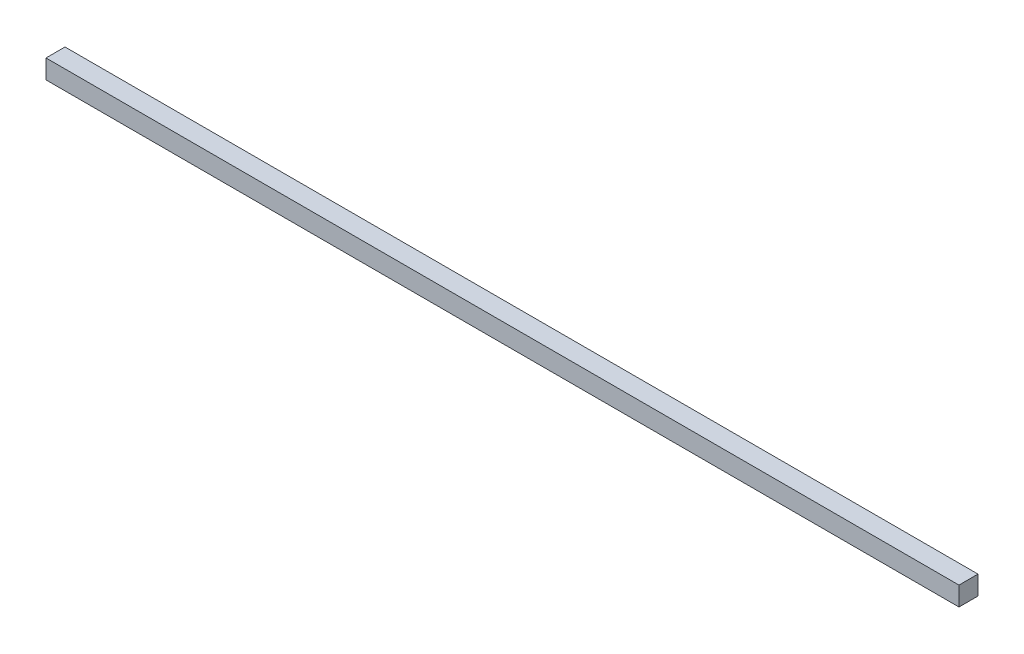
ISO-10303-21;
HEADER;
FILE_DESCRIPTION(('STEP AP214'),'2;1');
FILE_NAME('part.step','',(''),(''),'','','');
FILE_SCHEMA(('AUTOMOTIVE_DESIGN { 1 0 10303 214 1 1 1 1 }'));
ENDSEC;
DATA;
#1=APPLICATION_CONTEXT('core data for automotive mechanical design processes');
#2=APPLICATION_PROTOCOL_DEFINITION('international standard','automotive_design',2000,#1);
#3=PRODUCT_CONTEXT('',#1,'mechanical');
#4=PRODUCT('Part','Part','',(#3));
#5=PRODUCT_RELATED_PRODUCT_CATEGORY('part','',(#4));
#6=PRODUCT_DEFINITION_FORMATION('','',#4);
#7=PRODUCT_DEFINITION_CONTEXT('part definition',#1,'design');
#8=PRODUCT_DEFINITION('design','',#6,#7);
#9=PRODUCT_DEFINITION_SHAPE('','',#8);
#10=(LENGTH_UNIT() NAMED_UNIT(*) SI_UNIT(.MILLI.,.METRE.));
#11=(NAMED_UNIT(*) PLANE_ANGLE_UNIT() SI_UNIT($,.RADIAN.));
#12=(NAMED_UNIT(*) SI_UNIT($,.STERADIAN.) SOLID_ANGLE_UNIT());
#13=UNCERTAINTY_MEASURE_WITH_UNIT(LENGTH_MEASURE(1.E-05),#10,'distance_accuracy_value','');
#14=(GEOMETRIC_REPRESENTATION_CONTEXT(3) GLOBAL_UNCERTAINTY_ASSIGNED_CONTEXT((#13)) GLOBAL_UNIT_ASSIGNED_CONTEXT((#10,
#11,#12)) REPRESENTATION_CONTEXT('',''));
#15=CARTESIAN_POINT('',(0.,0.,0.));
#16=DIRECTION('',(0.,0.,1.));
#17=DIRECTION('',(1.,0.,0.));
#18=AXIS2_PLACEMENT_3D('',#15,#16,#17);
#19=CARTESIAN_POINT('',(0.,3.175,0.));
#20=DIRECTION('',(1.,0.,0.));
#21=DIRECTION('',(0.,0.,-1.));
#22=AXIS2_PLACEMENT_3D('',#19,#20,#21);
#23=PLANE('',#22);
#24=DIRECTION('',(0.,0.,1.));
#25=VECTOR('',#24,1.);
#26=CARTESIAN_POINT('',(0.,0.,0.));
#27=LINE('',#26,#25);
#28=CARTESIAN_POINT('',(0.,0.,-3.175));
#29=VERTEX_POINT('',#28);
#30=CARTESIAN_POINT('',(0.,0.,0.));
#31=VERTEX_POINT('',#30);
#32=EDGE_CURVE('E105',#29,#31,#27,.T.);
#33=ORIENTED_EDGE('',*,*,#32,.T.);
#34=DIRECTION('',(0.,-1.,0.));
#35=VECTOR('',#34,1.);
#36=CARTESIAN_POINT('',(0.,3.175,0.));
#37=LINE('',#36,#35);
#38=CARTESIAN_POINT('',(0.,3.175,0.));
#39=VERTEX_POINT('',#38);
#40=EDGE_CURVE('E11',#39,#31,#37,.T.);
#41=ORIENTED_EDGE('',*,*,#40,.F.);
#42=DIRECTION('',(0.,0.,1.));
#43=VECTOR('',#42,1.);
#44=CARTESIAN_POINT('',(0.,3.175,0.));
#45=LINE('',#44,#43);
#46=CARTESIAN_POINT('',(0.,3.175,-3.175));
#47=VERTEX_POINT('',#46);
#48=EDGE_CURVE('E89',#47,#39,#45,.T.);
#49=ORIENTED_EDGE('',*,*,#48,.F.);
#50=DIRECTION('',(0.,-1.,0.));
#51=VECTOR('',#50,1.);
#52=CARTESIAN_POINT('',(0.,3.175,-3.175));
#53=LINE('',#52,#51);
#54=EDGE_CURVE('E97',#47,#29,#53,.T.);
#55=ORIENTED_EDGE('',*,*,#54,.T.);
#56=EDGE_LOOP('',(#33,#41,#49,#55));
#57=FACE_BOUND('',#56,.T.);
#58=ADVANCED_FACE('F39',(#57),#23,.F.);
#59=CARTESIAN_POINT('',(0.,3.175,0.));
#60=DIRECTION('',(0.,0.,-1.));
#61=DIRECTION('',(-1.,0.,0.));
#62=AXIS2_PLACEMENT_3D('',#59,#60,#61);
#63=PLANE('',#62);
#64=DIRECTION('',(1.,0.,0.));
#65=VECTOR('',#64,1.);
#66=CARTESIAN_POINT('',(0.,0.,0.));
#67=LINE('',#66,#65);
#68=CARTESIAN_POINT('',(152.4,0.,0.));
#69=VERTEX_POINT('',#68);
#70=EDGE_CURVE('E92',#31,#69,#67,.T.);
#71=ORIENTED_EDGE('',*,*,#70,.T.);
#72=DIRECTION('',(0.,-1.,0.));
#73=VECTOR('',#72,1.);
#74=CARTESIAN_POINT('',(152.4,3.175,0.));
#75=LINE('',#74,#73);
#76=CARTESIAN_POINT('',(152.4,3.175,0.));
#77=VERTEX_POINT('',#76);
#78=EDGE_CURVE('E50',#77,#69,#75,.T.);
#79=ORIENTED_EDGE('',*,*,#78,.F.);
#80=DIRECTION('',(1.,0.,0.));
#81=VECTOR('',#80,1.);
#82=CARTESIAN_POINT('',(0.,3.175,0.));
#83=LINE('',#82,#81);
#84=EDGE_CURVE('E82',#39,#77,#83,.T.);
#85=ORIENTED_EDGE('',*,*,#84,.F.);
#86=ORIENTED_EDGE('',*,*,#40,.T.);
#87=EDGE_LOOP('',(#71,#79,#85,#86));
#88=FACE_BOUND('',#87,.T.);
#89=ADVANCED_FACE('F93',(#88),#63,.F.);
#90=CARTESIAN_POINT('',(152.4,3.175,0.));
#91=DIRECTION('',(-1.,0.,0.));
#92=DIRECTION('',(0.,0.,1.));
#93=AXIS2_PLACEMENT_3D('',#90,#91,#92);
#94=PLANE('',#93);
#95=DIRECTION('',(0.,0.,-1.));
#96=VECTOR('',#95,1.);
#97=CARTESIAN_POINT('',(152.4,0.,0.));
#98=LINE('',#97,#96);
#99=CARTESIAN_POINT('',(152.4,0.,-3.175));
#100=VERTEX_POINT('',#99);
#101=EDGE_CURVE('E72',#69,#100,#98,.T.);
#102=ORIENTED_EDGE('',*,*,#101,.T.);
#103=DIRECTION('',(0.,-1.,0.));
#104=VECTOR('',#103,1.);
#105=CARTESIAN_POINT('',(152.4,3.175,-3.175));
#106=LINE('',#105,#104);
#107=CARTESIAN_POINT('',(152.4,3.175,-3.175));
#108=VERTEX_POINT('',#107);
#109=EDGE_CURVE('E94',#108,#100,#106,.T.);
#110=ORIENTED_EDGE('',*,*,#109,.F.);
#111=DIRECTION('',(0.,0.,-1.));
#112=VECTOR('',#111,1.);
#113=CARTESIAN_POINT('',(152.4,3.175,0.));
#114=LINE('',#113,#112);
#115=EDGE_CURVE('E88',#77,#108,#114,.T.);
#116=ORIENTED_EDGE('',*,*,#115,.F.);
#117=ORIENTED_EDGE('',*,*,#78,.T.);
#118=EDGE_LOOP('',(#102,#110,#116,#117));
#119=FACE_BOUND('',#118,.T.);
#120=ADVANCED_FACE('F96',(#119),#94,.F.);
#121=CARTESIAN_POINT('',(0.,3.175,-3.175));
#122=DIRECTION('',(0.,0.,1.));
#123=DIRECTION('',(1.,0.,0.));
#124=AXIS2_PLACEMENT_3D('',#121,#122,#123);
#125=PLANE('',#124);
#126=DIRECTION('',(-1.,0.,0.));
#127=VECTOR('',#126,1.);
#128=CARTESIAN_POINT('',(0.,0.,-3.175));
#129=LINE('',#128,#127);
#130=EDGE_CURVE('E76',#100,#29,#129,.T.);
#131=ORIENTED_EDGE('',*,*,#130,.T.);
#132=ORIENTED_EDGE('',*,*,#54,.F.);
#133=DIRECTION('',(-1.,0.,0.));
#134=VECTOR('',#133,1.);
#135=CARTESIAN_POINT('',(0.,3.175,-3.175));
#136=LINE('',#135,#134);
#137=EDGE_CURVE('E54',#108,#47,#136,.T.);
#138=ORIENTED_EDGE('',*,*,#137,.F.);
#139=ORIENTED_EDGE('',*,*,#109,.T.);
#140=EDGE_LOOP('',(#131,#132,#138,#139));
#141=FACE_BOUND('',#140,.T.);
#142=ADVANCED_FACE('F108',(#141),#125,.F.);
#143=CARTESIAN_POINT('',(0.,3.175,0.));
#144=DIRECTION('',(0.,-1.,0.));
#145=DIRECTION('',(0.,0.,-1.));
#146=AXIS2_PLACEMENT_3D('',#143,#144,#145);
#147=PLANE('',#146);
#148=ORIENTED_EDGE('',*,*,#48,.T.);
#149=ORIENTED_EDGE('',*,*,#84,.T.);
#150=ORIENTED_EDGE('',*,*,#115,.T.);
#151=ORIENTED_EDGE('',*,*,#137,.T.);
#152=EDGE_LOOP('',(#148,#149,#150,#151));
#153=FACE_BOUND('',#152,.T.);
#154=ADVANCED_FACE('F86',(#153),#147,.F.);
#155=CARTESIAN_POINT('',(0.,0.,0.));
#156=DIRECTION('',(0.,-1.,0.));
#157=DIRECTION('',(0.,0.,-1.));
#158=AXIS2_PLACEMENT_3D('',#155,#156,#157);
#159=PLANE('',#158);
#160=ORIENTED_EDGE('',*,*,#32,.F.);
#161=ORIENTED_EDGE('',*,*,#130,.F.);
#162=ORIENTED_EDGE('',*,*,#101,.F.);
#163=ORIENTED_EDGE('',*,*,#70,.F.);
#164=EDGE_LOOP('',(#160,#161,#162,#163));
#165=FACE_BOUND('',#164,.T.);
#166=ADVANCED_FACE('F115',(#165),#159,.T.);
#167=CLOSED_SHELL('',(#58,#89,#120,#142,#154,#166));
#168=MANIFOLD_SOLID_BREP('B2',#167);
#169=ADVANCED_BREP_SHAPE_REPRESENTATION('',(#18,#168),#14);
#170=SHAPE_DEFINITION_REPRESENTATION(#9,#169);
ENDSEC;
END-ISO-10303-21;
